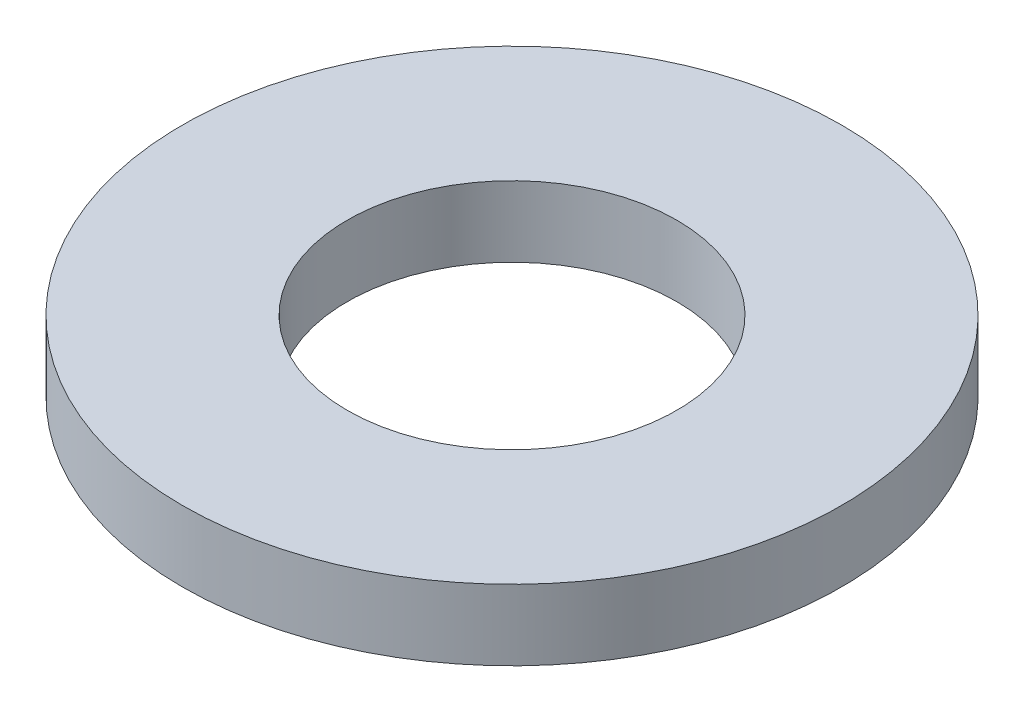
ISO-10303-21;
HEADER;
FILE_DESCRIPTION(('STEP AP214'),'2;1');
FILE_NAME('part.step','',(''),(''),'','','');
FILE_SCHEMA(('AUTOMOTIVE_DESIGN { 1 0 10303 214 1 1 1 1 }'));
ENDSEC;
DATA;
#1=APPLICATION_CONTEXT('core data for automotive mechanical design processes');
#2=APPLICATION_PROTOCOL_DEFINITION('international standard','automotive_design',2000,#1);
#3=PRODUCT_CONTEXT('',#1,'mechanical');
#4=PRODUCT('Part','Part','',(#3));
#5=PRODUCT_RELATED_PRODUCT_CATEGORY('part','',(#4));
#6=PRODUCT_DEFINITION_FORMATION('','',#4);
#7=PRODUCT_DEFINITION_CONTEXT('part definition',#1,'design');
#8=PRODUCT_DEFINITION('design','',#6,#7);
#9=PRODUCT_DEFINITION_SHAPE('','',#8);
#10=(LENGTH_UNIT() NAMED_UNIT(*) SI_UNIT(.MILLI.,.METRE.));
#11=(NAMED_UNIT(*) PLANE_ANGLE_UNIT() SI_UNIT($,.RADIAN.));
#12=(NAMED_UNIT(*) SI_UNIT($,.STERADIAN.) SOLID_ANGLE_UNIT());
#13=UNCERTAINTY_MEASURE_WITH_UNIT(LENGTH_MEASURE(1.E-05),#10,'distance_accuracy_value','');
#14=(GEOMETRIC_REPRESENTATION_CONTEXT(3) GLOBAL_UNCERTAINTY_ASSIGNED_CONTEXT((#13)) GLOBAL_UNIT_ASSIGNED_CONTEXT((#10,
#11,#12)) REPRESENTATION_CONTEXT('',''));
#15=CARTESIAN_POINT('',(0.,0.,0.));
#16=DIRECTION('',(0.,0.,1.));
#17=DIRECTION('',(1.,0.,0.));
#18=AXIS2_PLACEMENT_3D('',#15,#16,#17);
#19=CARTESIAN_POINT('',(0.,1.5,0.));
#20=DIRECTION('',(0.,1.,0.));
#21=DIRECTION('',(0.,0.,1.));
#22=AXIS2_PLACEMENT_3D('',#19,#20,#21);
#23=PLANE('',#22);
#24=CARTESIAN_POINT('',(0.,1.5,0.));
#25=DIRECTION('',(0.,1.,0.));
#26=DIRECTION('',(0.,0.,1.));
#27=AXIS2_PLACEMENT_3D('',#24,#25,#26);
#28=CIRCLE('',#27,14.);
#29=CARTESIAN_POINT('',(0.,1.5,14.));
#30=VERTEX_POINT('',#29);
#31=EDGE_CURVE('E10',#30,#30,#28,.T.);
#32=ORIENTED_EDGE('',*,*,#31,.T.);
#33=EDGE_LOOP('',(#32));
#34=FACE_BOUND('',#33,.T.);
#35=CARTESIAN_POINT('',(0.,1.5,0.));
#36=DIRECTION('',(0.,1.,0.));
#37=DIRECTION('',(0.,0.,1.));
#38=AXIS2_PLACEMENT_3D('',#35,#36,#37);
#39=CIRCLE('',#38,7.);
#40=CARTESIAN_POINT('',(0.,1.5,7.));
#41=VERTEX_POINT('',#40);
#42=EDGE_CURVE('E42',#41,#41,#39,.T.);
#43=ORIENTED_EDGE('',*,*,#42,.F.);
#44=EDGE_LOOP('',(#43));
#45=FACE_BOUND('',#44,.T.);
#46=ADVANCED_FACE('F31',(#34,#45),#23,.T.);
#47=CARTESIAN_POINT('',(0.,-1.5,0.));
#48=DIRECTION('',(0.,1.,0.));
#49=DIRECTION('',(0.,0.,1.));
#50=AXIS2_PLACEMENT_3D('',#47,#48,#49);
#51=PLANE('',#50);
#52=CARTESIAN_POINT('',(0.,-1.5,0.));
#53=DIRECTION('',(0.,1.,0.));
#54=DIRECTION('',(0.,0.,1.));
#55=AXIS2_PLACEMENT_3D('',#52,#53,#54);
#56=CIRCLE('',#55,14.);
#57=CARTESIAN_POINT('',(0.,-1.5,14.));
#58=VERTEX_POINT('',#57);
#59=EDGE_CURVE('E35',#58,#58,#56,.T.);
#60=ORIENTED_EDGE('',*,*,#59,.F.);
#61=EDGE_LOOP('',(#60));
#62=FACE_BOUND('',#61,.T.);
#63=CARTESIAN_POINT('',(0.,-1.5,0.));
#64=DIRECTION('',(0.,1.,0.));
#65=DIRECTION('',(0.,0.,1.));
#66=AXIS2_PLACEMENT_3D('',#63,#64,#65);
#67=CIRCLE('',#66,7.);
#68=CARTESIAN_POINT('',(0.,-1.5,7.));
#69=VERTEX_POINT('',#68);
#70=EDGE_CURVE('E44',#69,#69,#67,.T.);
#71=ORIENTED_EDGE('',*,*,#70,.T.);
#72=EDGE_LOOP('',(#71));
#73=FACE_BOUND('',#72,.T.);
#74=ADVANCED_FACE('F54',(#62,#73),#51,.F.);
#75=CARTESIAN_POINT('',(0.,1.5,0.));
#76=DIRECTION('',(0.,-1.,0.));
#77=DIRECTION('',(0.,0.,-1.));
#78=AXIS2_PLACEMENT_3D('',#75,#76,#77);
#79=CYLINDRICAL_SURFACE('',#78,14.);
#80=ORIENTED_EDGE('',*,*,#31,.F.);
#81=EDGE_LOOP('',(#80));
#82=FACE_BOUND('',#81,.T.);
#83=ORIENTED_EDGE('',*,*,#59,.T.);
#84=EDGE_LOOP('',(#83));
#85=FACE_BOUND('',#84,.T.);
#86=ADVANCED_FACE('F33',(#82,#85),#79,.T.);
#87=CARTESIAN_POINT('',(0.,1.5,0.));
#88=DIRECTION('',(0.,-1.,0.));
#89=DIRECTION('',(0.,0.,-1.));
#90=AXIS2_PLACEMENT_3D('',#87,#88,#89);
#91=CYLINDRICAL_SURFACE('',#90,7.);
#92=ORIENTED_EDGE('',*,*,#42,.T.);
#93=EDGE_LOOP('',(#92));
#94=FACE_BOUND('',#93,.T.);
#95=ORIENTED_EDGE('',*,*,#70,.F.);
#96=EDGE_LOOP('',(#95));
#97=FACE_BOUND('',#96,.T.);
#98=ADVANCED_FACE('F50',(#94,#97),#91,.F.);
#99=CLOSED_SHELL('',(#46,#74,#86,#98));
#100=MANIFOLD_SOLID_BREP('B2',#99);
#101=ADVANCED_BREP_SHAPE_REPRESENTATION('',(#18,#100),#14);
#102=SHAPE_DEFINITION_REPRESENTATION(#9,#101);
ENDSEC;
END-ISO-10303-21;
